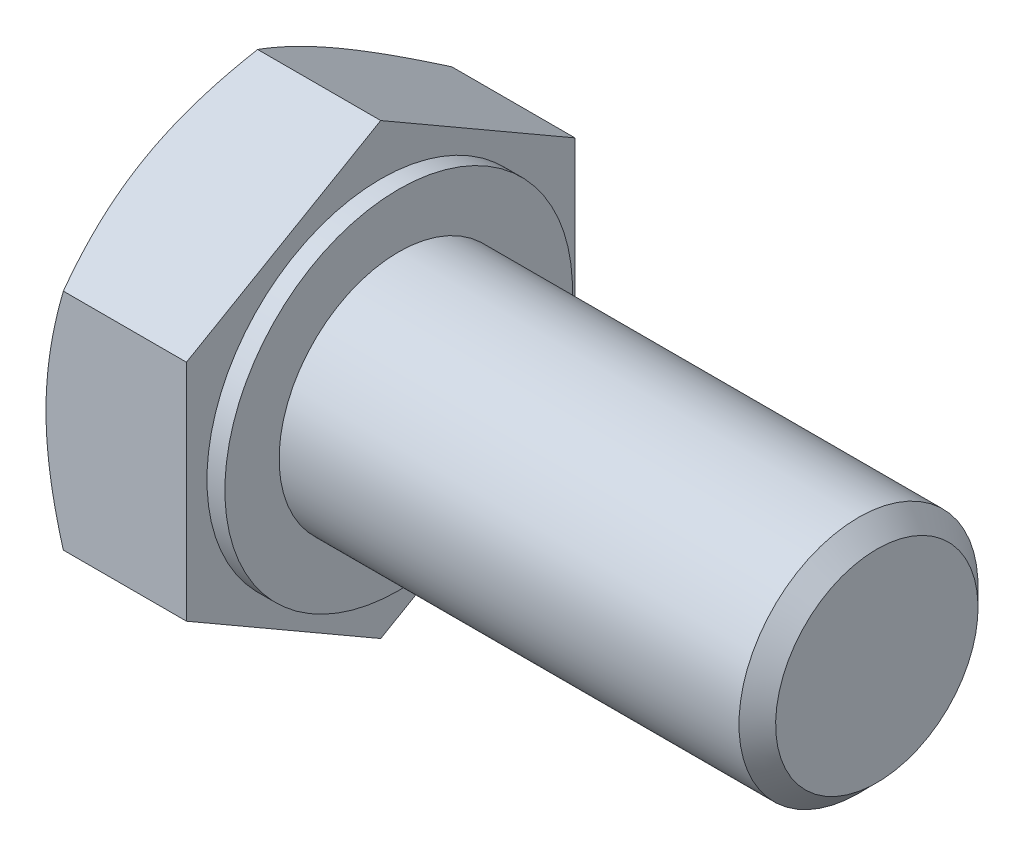
ISO-10303-21;
HEADER;
FILE_DESCRIPTION(('STEP AP214'),'2;1');
FILE_NAME('part.step','',(''),(''),'','','');
FILE_SCHEMA(('AUTOMOTIVE_DESIGN { 1 0 10303 214 1 1 1 1 }'));
ENDSEC;
DATA;
#1=APPLICATION_CONTEXT('core data for automotive mechanical design processes');
#2=APPLICATION_PROTOCOL_DEFINITION('international standard','automotive_design',2000,#1);
#3=PRODUCT_CONTEXT('',#1,'mechanical');
#4=PRODUCT('Part','Part','',(#3));
#5=PRODUCT_RELATED_PRODUCT_CATEGORY('part','',(#4));
#6=PRODUCT_DEFINITION_FORMATION('','',#4);
#7=PRODUCT_DEFINITION_CONTEXT('part definition',#1,'design');
#8=PRODUCT_DEFINITION('design','',#6,#7);
#9=PRODUCT_DEFINITION_SHAPE('','',#8);
#10=(LENGTH_UNIT() NAMED_UNIT(*) SI_UNIT(.MILLI.,.METRE.));
#11=(NAMED_UNIT(*) PLANE_ANGLE_UNIT() SI_UNIT($,.RADIAN.));
#12=(NAMED_UNIT(*) SI_UNIT($,.STERADIAN.) SOLID_ANGLE_UNIT());
#13=UNCERTAINTY_MEASURE_WITH_UNIT(LENGTH_MEASURE(1.E-05),#10,'distance_accuracy_value','');
#14=(GEOMETRIC_REPRESENTATION_CONTEXT(3) GLOBAL_UNCERTAINTY_ASSIGNED_CONTEXT((#13)) GLOBAL_UNIT_ASSIGNED_CONTEXT((#10,
#11,#12)) REPRESENTATION_CONTEXT('',''));
#15=CARTESIAN_POINT('',(0.,0.,0.));
#16=DIRECTION('',(0.,0.,1.));
#17=DIRECTION('',(1.,0.,0.));
#18=AXIS2_PLACEMENT_3D('',#15,#16,#17);
#19=CARTESIAN_POINT('',(15.693225,0.,0.));
#20=DIRECTION('',(-1.,0.,0.));
#21=DIRECTION('',(0.,-1.,0.));
#22=AXIS2_PLACEMENT_3D('',#19,#20,#21);
#23=CONICAL_SURFACE('',#22,3.693275,0.785316663805123);
#24=CARTESIAN_POINT('',(16.,0.,0.));
#25=DIRECTION('',(-1.,0.,0.));
#26=DIRECTION('',(0.,-1.,0.));
#27=AXIS2_PLACEMENT_3D('',#24,#25,#26);
#28=CIRCLE('',#27,3.38655);
#29=CARTESIAN_POINT('',(16.,3.38655,0.));
#30=VERTEX_POINT('',#29);
#31=EDGE_CURVE('E11',#30,#30,#28,.T.);
#32=ORIENTED_EDGE('',*,*,#31,.T.);
#33=DIRECTION('',(-0.707164407752514,0.707049149923848,0.));
#34=VECTOR('',#33,1.);
#35=CARTESIAN_POINT('',(15.693225,3.693275,0.));
#36=LINE('',#35,#34);
#37=CARTESIAN_POINT('',(15.38645,4.,0.));
#38=VERTEX_POINT('',#37);
#39=EDGE_CURVE('E27',#30,#38,#36,.T.);
#40=ORIENTED_EDGE('',*,*,#39,.T.);
#41=CARTESIAN_POINT('',(15.38645,0.,0.));
#42=DIRECTION('',(1.,0.,0.));
#43=DIRECTION('',(0.,-1.,0.));
#44=AXIS2_PLACEMENT_3D('',#41,#42,#43);
#45=CIRCLE('',#44,4.);
#46=CARTESIAN_POINT('',(15.38645,-4.,0.));
#47=VERTEX_POINT('',#46);
#48=EDGE_CURVE('E213',#38,#47,#45,.T.);
#49=ORIENTED_EDGE('',*,*,#48,.T.);
#50=CARTESIAN_POINT('',(15.38645,0.,0.));
#51=DIRECTION('',(1.,0.,0.));
#52=DIRECTION('',(0.,-1.,0.));
#53=AXIS2_PLACEMENT_3D('',#50,#51,#52);
#54=CIRCLE('',#53,4.);
#55=EDGE_CURVE('E206',#47,#38,#54,.T.);
#56=ORIENTED_EDGE('',*,*,#55,.T.);
#57=ORIENTED_EDGE('',*,*,#39,.F.);
#58=EDGE_LOOP('',(#32,#40,#49,#56,#57));
#59=FACE_BOUND('',#58,.T.);
#60=ADVANCED_FACE('F16',(#59),#23,.T.);
#61=CARTESIAN_POINT('',(9.5,0.,0.));
#62=DIRECTION('',(1.,0.,0.));
#63=DIRECTION('',(0.,1.,0.));
#64=AXIS2_PLACEMENT_3D('',#61,#62,#63);
#65=CYLINDRICAL_SURFACE('',#64,4.);
#66=ORIENTED_EDGE('',*,*,#48,.F.);
#67=ORIENTED_EDGE('',*,*,#55,.F.);
#68=DIRECTION('',(-1.,0.,0.));
#69=VECTOR('',#68,1.);
#70=CARTESIAN_POINT('',(9.5,-4.,0.));
#71=LINE('',#70,#69);
#72=CARTESIAN_POINT('',(0.,-4.,0.));
#73=VERTEX_POINT('',#72);
#74=EDGE_CURVE('E164',#47,#73,#71,.T.);
#75=ORIENTED_EDGE('',*,*,#74,.T.);
#76=CARTESIAN_POINT('',(0.,0.,0.));
#77=DIRECTION('',(1.,0.,0.));
#78=DIRECTION('',(0.,1.,0.));
#79=AXIS2_PLACEMENT_3D('',#76,#77,#78);
#80=CIRCLE('',#79,4.);
#81=CARTESIAN_POINT('',(0.,4.,0.));
#82=VERTEX_POINT('',#81);
#83=EDGE_CURVE('E159',#73,#82,#80,.T.);
#84=ORIENTED_EDGE('',*,*,#83,.T.);
#85=CARTESIAN_POINT('',(0.,0.,0.));
#86=DIRECTION('',(1.,0.,0.));
#87=DIRECTION('',(0.,1.,0.));
#88=AXIS2_PLACEMENT_3D('',#85,#86,#87);
#89=CIRCLE('',#88,4.);
#90=EDGE_CURVE('E163',#82,#73,#89,.T.);
#91=ORIENTED_EDGE('',*,*,#90,.T.);
#92=ORIENTED_EDGE('',*,*,#74,.F.);
#93=EDGE_LOOP('',(#66,#67,#75,#84,#91,#92));
#94=FACE_BOUND('',#93,.T.);
#95=ADVANCED_FACE('F161',(#94),#65,.T.);
#96=CARTESIAN_POINT('',(16.,2.,0.));
#97=DIRECTION('',(1.,0.,0.));
#98=DIRECTION('',(0.,1.,0.));
#99=AXIS2_PLACEMENT_3D('',#96,#97,#98);
#100=PLANE('',#99);
#101=ORIENTED_EDGE('',*,*,#31,.F.);
#102=EDGE_LOOP('',(#101));
#103=FACE_BOUND('',#102,.T.);
#104=ADVANCED_FACE('F443',(#103),#100,.T.);
#105=CARTESIAN_POINT('',(-5.00982170819963,0.,0.));
#106=DIRECTION('',(1.,0.,0.));
#107=DIRECTION('',(0.,1.,0.));
#108=AXIS2_PLACEMENT_3D('',#105,#106,#107);
#109=CONICAL_SURFACE('',#108,7.00277674973256,1.0471975511966);
#110=CARTESIAN_POINT('',(-5.3001,5.62916512459884,3.25));
#111=CARTESIAN_POINT('',(-5.30010000000002,4.7583302491977,4.75833024919769));
#112=CARTESIAN_POINT('',(-4.71954341639926,3.75277674973257,6.5));
#113=(BOUNDED_CURVE() B_SPLINE_CURVE(2,(#110,#111,#112),.UNSPECIFIED.,.F.,
.F.) B_SPLINE_CURVE_WITH_KNOTS((3,3),(0.380711317203905,0.76142263440781),
.UNSPECIFIED.) CURVE() GEOMETRIC_REPRESENTATION_ITEM() RATIONAL_B_SPLINE_CURVE((1.,
1.03795484930203,1.)) REPRESENTATION_ITEM(''));
#114=CARTESIAN_POINT('',(-5.3001,5.62916512459884,3.25));
#115=VERTEX_POINT('',#114);
#116=CARTESIAN_POINT('',(-4.71954341639926,3.75277674973253,6.5));
#117=VERTEX_POINT('',#116);
#118=EDGE_CURVE('E188',#115,#117,#113,.T.);
#119=ORIENTED_EDGE('',*,*,#118,.F.);
#120=CARTESIAN_POINT('',(-5.3001,0.,0.));
#121=DIRECTION('',(-1.,0.,0.));
#122=DIRECTION('',(0.,1.,0.));
#123=AXIS2_PLACEMENT_3D('',#120,#121,#122);
#124=CIRCLE('',#123,6.5);
#125=CARTESIAN_POINT('',(-5.3001,0.,6.5));
#126=VERTEX_POINT('',#125);
#127=EDGE_CURVE('E299',#126,#115,#124,.T.);
#128=ORIENTED_EDGE('',*,*,#127,.F.);
#129=CARTESIAN_POINT('',(-4.71954341639926,3.75277674973253,6.5));
#130=CARTESIAN_POINT('',(-5.30010000000001,1.74166975080228,6.5));
#131=CARTESIAN_POINT('',(-5.3001,0.,6.5));
#132=(BOUNDED_CURVE() B_SPLINE_CURVE(2,(#129,#130,#131),.UNSPECIFIED.,.F.,
.F.) B_SPLINE_CURVE_WITH_KNOTS((3,3),(0.,0.380711317203905),
.UNSPECIFIED.) CURVE() GEOMETRIC_REPRESENTATION_ITEM() RATIONAL_B_SPLINE_CURVE((1.,
1.03795484930204,1.)) REPRESENTATION_ITEM(''));
#133=EDGE_CURVE('E204',#117,#126,#132,.T.);
#134=ORIENTED_EDGE('',*,*,#133,.F.);
#135=EDGE_LOOP('',(#119,#128,#134));
#136=FACE_BOUND('',#135,.T.);
#137=ADVANCED_FACE('F416',(#136),#109,.T.);
#138=CARTESIAN_POINT('',(-5.00982170819963,0.,0.));
#139=DIRECTION('',(1.,0.,0.));
#140=DIRECTION('',(0.,1.,0.));
#141=AXIS2_PLACEMENT_3D('',#138,#139,#140);
#142=CONICAL_SURFACE('',#141,7.00277674973256,1.0471975511966);
#143=CARTESIAN_POINT('',(-4.71954341639926,-3.75277674973259,6.5));
#144=CARTESIAN_POINT('',(-5.30010000000001,-4.75833024919772,4.75833024919769));
#145=CARTESIAN_POINT('',(-5.3001,-5.62916512459885,3.25));
#146=(BOUNDED_CURVE() B_SPLINE_CURVE(2,(#143,#144,#145),.UNSPECIFIED.,.F.,
.F.) B_SPLINE_CURVE_WITH_KNOTS((3,3),(0.,0.380711317203904),
.UNSPECIFIED.) CURVE() GEOMETRIC_REPRESENTATION_ITEM() RATIONAL_B_SPLINE_CURVE((1.,
1.03795484930205,1.)) REPRESENTATION_ITEM(''));
#147=CARTESIAN_POINT('',(-4.71954341639926,-3.75277674973254,6.5));
#148=VERTEX_POINT('',#147);
#149=CARTESIAN_POINT('',(-5.3001,-5.62916512459885,3.25));
#150=VERTEX_POINT('',#149);
#151=EDGE_CURVE('E308',#148,#150,#146,.T.);
#152=ORIENTED_EDGE('',*,*,#151,.F.);
#153=CARTESIAN_POINT('',(-5.3001,0.,6.5));
#154=CARTESIAN_POINT('',(-5.30010000000001,-1.74166975080229,6.49999999999999));
#155=CARTESIAN_POINT('',(-4.71954341639926,-3.75277674973254,6.5));
#156=(BOUNDED_CURVE() B_SPLINE_CURVE(2,(#153,#154,#155),.UNSPECIFIED.,.F.,
.F.) B_SPLINE_CURVE_WITH_KNOTS((3,3),(0.380711317203905,0.76142263440781),
.UNSPECIFIED.) CURVE() GEOMETRIC_REPRESENTATION_ITEM() RATIONAL_B_SPLINE_CURVE((1.,
1.03795484930202,1.)) REPRESENTATION_ITEM(''));
#157=EDGE_CURVE('E214',#126,#148,#156,.T.);
#158=ORIENTED_EDGE('',*,*,#157,.F.);
#159=CARTESIAN_POINT('',(-5.3001,0.,0.));
#160=DIRECTION('',(-1.,0.,0.));
#161=DIRECTION('',(0.,1.,0.));
#162=AXIS2_PLACEMENT_3D('',#159,#160,#161);
#163=CIRCLE('',#162,6.5);
#164=EDGE_CURVE('E347',#150,#126,#163,.T.);
#165=ORIENTED_EDGE('',*,*,#164,.F.);
#166=EDGE_LOOP('',(#152,#158,#165));
#167=FACE_BOUND('',#166,.T.);
#168=ADVANCED_FACE('F410',(#167),#142,.T.);
#169=CARTESIAN_POINT('',(-5.00982170819963,0.,0.));
#170=DIRECTION('',(1.,0.,0.));
#171=DIRECTION('',(0.,1.,0.));
#172=AXIS2_PLACEMENT_3D('',#169,#170,#171);
#173=CONICAL_SURFACE('',#172,7.00277674973256,1.0471975511966);
#174=CARTESIAN_POINT('',(-5.3001,5.62916512459885,-3.25));
#175=CARTESIAN_POINT('',(-5.30010000000001,6.49999999999999,-1.74166975080229));
#176=CARTESIAN_POINT('',(-4.71954341639926,7.50555349946511,0.));
#177=(BOUNDED_CURVE() B_SPLINE_CURVE(2,(#174,#175,#176),.UNSPECIFIED.,.F.,
.F.) B_SPLINE_CURVE_WITH_KNOTS((3,3),(0.380711317203905,0.76142263440781),
.UNSPECIFIED.) CURVE() GEOMETRIC_REPRESENTATION_ITEM() RATIONAL_B_SPLINE_CURVE((1.,
1.03795484930206,1.)) REPRESENTATION_ITEM(''));
#178=CARTESIAN_POINT('',(-5.3001,5.62916512459885,-3.25));
#179=VERTEX_POINT('',#178);
#180=CARTESIAN_POINT('',(-4.71954341639926,7.50555349946511,0.));
#181=VERTEX_POINT('',#180);
#182=EDGE_CURVE('E222',#179,#181,#177,.T.);
#183=ORIENTED_EDGE('',*,*,#182,.F.);
#184=CARTESIAN_POINT('',(-5.3001,0.,0.));
#185=DIRECTION('',(-1.,0.,0.));
#186=DIRECTION('',(0.,1.,0.));
#187=AXIS2_PLACEMENT_3D('',#184,#185,#186);
#188=CIRCLE('',#187,6.5);
#189=EDGE_CURVE('E303',#115,#179,#188,.T.);
#190=ORIENTED_EDGE('',*,*,#189,.F.);
#191=CARTESIAN_POINT('',(-4.71954341639926,7.50555349946512,0.));
#192=CARTESIAN_POINT('',(-5.30010000000001,6.5,1.74166975080231));
#193=CARTESIAN_POINT('',(-5.3001,5.62916512459884,3.25));
#194=(BOUNDED_CURVE() B_SPLINE_CURVE(2,(#191,#192,#193),.UNSPECIFIED.,.F.,
.F.) B_SPLINE_CURVE_WITH_KNOTS((3,3),(0.,0.380711317203905),
.UNSPECIFIED.) CURVE() GEOMETRIC_REPRESENTATION_ITEM() RATIONAL_B_SPLINE_CURVE((1.,
1.03795484930205,1.)) REPRESENTATION_ITEM(''));
#195=EDGE_CURVE('E194',#181,#115,#194,.T.);
#196=ORIENTED_EDGE('',*,*,#195,.F.);
#197=EDGE_LOOP('',(#183,#190,#196));
#198=FACE_BOUND('',#197,.T.);
#199=ADVANCED_FACE('F418',(#198),#173,.T.);
#200=CARTESIAN_POINT('',(-5.00982170819963,0.,0.));
#201=DIRECTION('',(1.,0.,0.));
#202=DIRECTION('',(0.,-1.,0.));
#203=AXIS2_PLACEMENT_3D('',#200,#201,#202);
#204=CONICAL_SURFACE('',#203,7.00277674973256,1.0471975511966);
#205=CARTESIAN_POINT('',(-4.71954341639926,-7.50555349946512,0.));
#206=CARTESIAN_POINT('',(-5.30010000000001,-6.49999999999999,-1.74166975080231));
#207=CARTESIAN_POINT('',(-5.3001,-5.62916512459885,-3.25));
#208=(BOUNDED_CURVE() B_SPLINE_CURVE(2,(#205,#206,#207),.UNSPECIFIED.,.F.,
.F.) B_SPLINE_CURVE_WITH_KNOTS((3,3),(0.,0.380711317203904),
.UNSPECIFIED.) CURVE() GEOMETRIC_REPRESENTATION_ITEM() RATIONAL_B_SPLINE_CURVE((1.,
1.03795484930204,1.)) REPRESENTATION_ITEM(''));
#209=CARTESIAN_POINT('',(-4.71954341639926,-7.50555349946511,0.));
#210=VERTEX_POINT('',#209);
#211=CARTESIAN_POINT('',(-5.3001,-5.62916512459885,-3.25));
#212=VERTEX_POINT('',#211);
#213=EDGE_CURVE('E302',#210,#212,#208,.T.);
#214=ORIENTED_EDGE('',*,*,#213,.F.);
#215=CARTESIAN_POINT('',(-5.3001,-5.62916512459885,3.25));
#216=CARTESIAN_POINT('',(-5.30010000000001,-6.5,1.74166975080231));
#217=CARTESIAN_POINT('',(-4.71954341639926,-7.50555349946511,0.));
#218=(BOUNDED_CURVE() B_SPLINE_CURVE(2,(#215,#216,#217),.UNSPECIFIED.,.F.,
.F.) B_SPLINE_CURVE_WITH_KNOTS((3,3),(0.380711317203904,0.761422634407808),
.UNSPECIFIED.) CURVE() GEOMETRIC_REPRESENTATION_ITEM() RATIONAL_B_SPLINE_CURVE((1.,
1.03795484930205,1.)) REPRESENTATION_ITEM(''));
#219=EDGE_CURVE('E195',#150,#210,#218,.T.);
#220=ORIENTED_EDGE('',*,*,#219,.F.);
#221=CARTESIAN_POINT('',(-5.3001,0.,0.));
#222=DIRECTION('',(-1.,0.,0.));
#223=DIRECTION('',(0.,1.,0.));
#224=AXIS2_PLACEMENT_3D('',#221,#222,#223);
#225=CIRCLE('',#224,6.5);
#226=EDGE_CURVE('E118',#212,#150,#225,.T.);
#227=ORIENTED_EDGE('',*,*,#226,.F.);
#228=EDGE_LOOP('',(#214,#220,#227));
#229=FACE_BOUND('',#228,.T.);
#230=ADVANCED_FACE('F379',(#229),#204,.T.);
#231=CARTESIAN_POINT('',(-5.00982170819963,0.,0.));
#232=DIRECTION('',(1.,0.,0.));
#233=DIRECTION('',(0.,1.,0.));
#234=AXIS2_PLACEMENT_3D('',#231,#232,#233);
#235=CONICAL_SURFACE('',#234,7.00277674973256,1.0471975511966);
#236=CARTESIAN_POINT('',(-5.3001,0.,-6.5));
#237=CARTESIAN_POINT('',(-5.30010000000001,1.74166975080229,-6.5));
#238=CARTESIAN_POINT('',(-4.71954341639926,3.75277674973254,-6.5));
#239=(BOUNDED_CURVE() B_SPLINE_CURVE(2,(#236,#237,#238),.UNSPECIFIED.,.F.,
.F.) B_SPLINE_CURVE_WITH_KNOTS((3,3),(0.380711317203905,0.761422634407809),
.UNSPECIFIED.) CURVE() GEOMETRIC_REPRESENTATION_ITEM() RATIONAL_B_SPLINE_CURVE((1.,
1.03795484930204,1.)) REPRESENTATION_ITEM(''));
#240=CARTESIAN_POINT('',(-5.3001,0.,-6.5));
#241=VERTEX_POINT('',#240);
#242=CARTESIAN_POINT('',(-4.71954341639926,3.75277674973253,-6.5));
#243=VERTEX_POINT('',#242);
#244=EDGE_CURVE('E177',#241,#243,#239,.T.);
#245=ORIENTED_EDGE('',*,*,#244,.F.);
#246=CARTESIAN_POINT('',(-5.3001,0.,0.));
#247=DIRECTION('',(-1.,0.,0.));
#248=DIRECTION('',(0.,1.,0.));
#249=AXIS2_PLACEMENT_3D('',#246,#247,#248);
#250=CIRCLE('',#249,6.5);
#251=EDGE_CURVE('E106',#179,#241,#250,.T.);
#252=ORIENTED_EDGE('',*,*,#251,.F.);
#253=CARTESIAN_POINT('',(-4.71954341639926,3.75277674973258,-6.5));
#254=CARTESIAN_POINT('',(-5.30010000000001,4.75833024919771,-4.7583302491977));
#255=CARTESIAN_POINT('',(-5.3001,5.62916512459885,-3.25));
#256=(BOUNDED_CURVE() B_SPLINE_CURVE(2,(#253,#254,#255),.UNSPECIFIED.,.F.,
.F.) B_SPLINE_CURVE_WITH_KNOTS((3,3),(0.,0.380711317203905),
.UNSPECIFIED.) CURVE() GEOMETRIC_REPRESENTATION_ITEM() RATIONAL_B_SPLINE_CURVE((1.,
1.03795484930205,1.)) REPRESENTATION_ITEM(''));
#257=EDGE_CURVE('E187',#243,#179,#256,.T.);
#258=ORIENTED_EDGE('',*,*,#257,.F.);
#259=EDGE_LOOP('',(#245,#252,#258));
#260=FACE_BOUND('',#259,.T.);
#261=ADVANCED_FACE('F420',(#260),#235,.T.);
#262=CARTESIAN_POINT('',(-5.00982170819963,0.,0.));
#263=DIRECTION('',(1.,0.,0.));
#264=DIRECTION('',(0.,1.,0.));
#265=AXIS2_PLACEMENT_3D('',#262,#263,#264);
#266=CONICAL_SURFACE('',#265,7.00277674973256,1.0471975511966);
#267=CARTESIAN_POINT('',(-4.71954341639926,-3.75277674973253,-6.5));
#268=CARTESIAN_POINT('',(-5.30010000000001,-1.74166975080229,-6.5));
#269=CARTESIAN_POINT('',(-5.3001,0.,-6.5));
#270=(BOUNDED_CURVE() B_SPLINE_CURVE(2,(#267,#268,#269),.UNSPECIFIED.,.F.,
.F.) B_SPLINE_CURVE_WITH_KNOTS((3,3),(0.,0.380711317203905),
.UNSPECIFIED.) CURVE() GEOMETRIC_REPRESENTATION_ITEM() RATIONAL_B_SPLINE_CURVE((1.,
1.03795484930204,1.)) REPRESENTATION_ITEM(''));
#271=CARTESIAN_POINT('',(-4.71954341639926,-3.75277674973258,-6.5));
#272=VERTEX_POINT('',#271);
#273=EDGE_CURVE('E170',#272,#241,#270,.T.);
#274=ORIENTED_EDGE('',*,*,#273,.F.);
#275=CARTESIAN_POINT('',(-5.3001,-5.62916512459885,-3.25));
#276=CARTESIAN_POINT('',(-5.30010000000001,-4.75833024919771,-4.7583302491977));
#277=CARTESIAN_POINT('',(-4.71954341639926,-3.75277674973258,-6.5));
#278=(BOUNDED_CURVE() B_SPLINE_CURVE(2,(#275,#276,#277),.UNSPECIFIED.,.F.,
.F.) B_SPLINE_CURVE_WITH_KNOTS((3,3),(0.380711317203904,0.761422634407809),
.UNSPECIFIED.) CURVE() GEOMETRIC_REPRESENTATION_ITEM() RATIONAL_B_SPLINE_CURVE((1.,
1.03795484930205,1.)) REPRESENTATION_ITEM(''));
#279=EDGE_CURVE('E319',#212,#272,#278,.T.);
#280=ORIENTED_EDGE('',*,*,#279,.F.);
#281=CARTESIAN_POINT('',(-5.3001,0.,0.));
#282=DIRECTION('',(-1.,0.,0.));
#283=DIRECTION('',(0.,1.,0.));
#284=AXIS2_PLACEMENT_3D('',#281,#282,#283);
#285=CIRCLE('',#284,6.5);
#286=EDGE_CURVE('E281',#241,#212,#285,.T.);
#287=ORIENTED_EDGE('',*,*,#286,.F.);
#288=EDGE_LOOP('',(#274,#280,#287));
#289=FACE_BOUND('',#288,.T.);
#290=ADVANCED_FACE('F425',(#289),#266,.T.);
#291=CARTESIAN_POINT('',(-0.600099999999993,-3.75277674973256,-6.5));
#292=DIRECTION('',(0.,0.,-1.));
#293=DIRECTION('',(-1.,0.,0.));
#294=AXIS2_PLACEMENT_3D('',#291,#292,#293);
#295=PLANE('',#294);
#296=ORIENTED_EDGE('',*,*,#273,.T.);
#297=ORIENTED_EDGE('',*,*,#244,.T.);
#298=DIRECTION('',(-1.,0.,0.));
#299=VECTOR('',#298,1.);
#300=CARTESIAN_POINT('',(-0.6001,3.75277674973256,-6.5));
#301=LINE('',#300,#299);
#302=CARTESIAN_POINT('',(-0.6001,3.75277674973256,-6.5));
#303=VERTEX_POINT('',#302);
#304=EDGE_CURVE('E231',#303,#243,#301,.T.);
#305=ORIENTED_EDGE('',*,*,#304,.F.);
#306=DIRECTION('',(0.,1.,0.));
#307=VECTOR('',#306,1.);
#308=CARTESIAN_POINT('',(-0.600099999999993,-3.75277674973256,-6.5));
#309=LINE('',#308,#307);
#310=CARTESIAN_POINT('',(-0.600099999999993,-3.75277674973256,-6.5));
#311=VERTEX_POINT('',#310);
#312=EDGE_CURVE('E240',#311,#303,#309,.T.);
#313=ORIENTED_EDGE('',*,*,#312,.F.);
#314=DIRECTION('',(-1.,0.,0.));
#315=VECTOR('',#314,1.);
#316=CARTESIAN_POINT('',(-0.600099999999993,-3.75277674973256,-6.5));
#317=LINE('',#316,#315);
#318=EDGE_CURVE('E183',#311,#272,#317,.T.);
#319=ORIENTED_EDGE('',*,*,#318,.T.);
#320=EDGE_LOOP('',(#296,#297,#305,#313,#319));
#321=FACE_BOUND('',#320,.T.);
#322=ADVANCED_FACE('F422',(#321),#295,.T.);
#323=CARTESIAN_POINT('',(-0.6001,3.75277674973256,-6.5));
#324=DIRECTION('',(0.,0.866025403784439,-0.5));
#325=DIRECTION('',(-1.,0.,0.));
#326=AXIS2_PLACEMENT_3D('',#323,#324,#325);
#327=PLANE('',#326);
#328=ORIENTED_EDGE('',*,*,#257,.T.);
#329=ORIENTED_EDGE('',*,*,#182,.T.);
#330=DIRECTION('',(-1.,0.,0.));
#331=VECTOR('',#330,1.);
#332=CARTESIAN_POINT('',(-0.6001,7.50555349946513,0.));
#333=LINE('',#332,#331);
#334=CARTESIAN_POINT('',(-0.6001,7.50555349946513,0.));
#335=VERTEX_POINT('',#334);
#336=EDGE_CURVE('E181',#335,#181,#333,.T.);
#337=ORIENTED_EDGE('',*,*,#336,.F.);
#338=DIRECTION('',(0.,0.5,0.866025403784439));
#339=VECTOR('',#338,1.);
#340=CARTESIAN_POINT('',(-0.6001,3.75277674973256,-6.5));
#341=LINE('',#340,#339);
#342=EDGE_CURVE('E220',#303,#335,#341,.T.);
#343=ORIENTED_EDGE('',*,*,#342,.F.);
#344=ORIENTED_EDGE('',*,*,#304,.T.);
#345=EDGE_LOOP('',(#328,#329,#337,#343,#344));
#346=FACE_BOUND('',#345,.T.);
#347=ADVANCED_FACE('F264',(#346),#327,.T.);
#348=CARTESIAN_POINT('',(-0.6001,7.50555349946513,0.));
#349=DIRECTION('',(0.,0.866025403784438,0.5));
#350=DIRECTION('',(1.,0.,0.));
#351=AXIS2_PLACEMENT_3D('',#348,#349,#350);
#352=PLANE('',#351);
#353=ORIENTED_EDGE('',*,*,#195,.T.);
#354=ORIENTED_EDGE('',*,*,#118,.T.);
#355=DIRECTION('',(-1.,0.,0.));
#356=VECTOR('',#355,1.);
#357=CARTESIAN_POINT('',(-0.6001,3.75277674973256,6.5));
#358=LINE('',#357,#356);
#359=CARTESIAN_POINT('',(-0.6001,3.75277674973256,6.5));
#360=VERTEX_POINT('',#359);
#361=EDGE_CURVE('E221',#360,#117,#358,.T.);
#362=ORIENTED_EDGE('',*,*,#361,.F.);
#363=DIRECTION('',(0.,-0.5,0.866025403784438));
#364=VECTOR('',#363,1.);
#365=CARTESIAN_POINT('',(-0.6001,7.50555349946513,0.));
#366=LINE('',#365,#364);
#367=EDGE_CURVE('E257',#335,#360,#366,.T.);
#368=ORIENTED_EDGE('',*,*,#367,.F.);
#369=ORIENTED_EDGE('',*,*,#336,.T.);
#370=EDGE_LOOP('',(#353,#354,#362,#368,#369));
#371=FACE_BOUND('',#370,.T.);
#372=ADVANCED_FACE('F269',(#371),#352,.T.);
#373=CARTESIAN_POINT('',(-0.6001,0.,0.));
#374=DIRECTION('',(1.,0.,0.));
#375=DIRECTION('',(0.,1.,0.));
#376=AXIS2_PLACEMENT_3D('',#373,#374,#375);
#377=PLANE('',#376);
#378=ORIENTED_EDGE('',*,*,#367,.T.);
#379=DIRECTION('',(0.,-1.,0.));
#380=VECTOR('',#379,1.);
#381=CARTESIAN_POINT('',(-0.6001,3.75277674973256,6.5));
#382=LINE('',#381,#380);
#383=CARTESIAN_POINT('',(-0.600099999999993,-3.75277674973257,6.5));
#384=VERTEX_POINT('',#383);
#385=EDGE_CURVE('E272',#360,#384,#382,.T.);
#386=ORIENTED_EDGE('',*,*,#385,.T.);
#387=DIRECTION('',(0.,-0.5,-0.866025403784439));
#388=VECTOR('',#387,1.);
#389=CARTESIAN_POINT('',(-0.600099999999993,-3.75277674973257,6.5));
#390=LINE('',#389,#388);
#391=CARTESIAN_POINT('',(-0.600099999999993,-7.50555349946513,0.));
#392=VERTEX_POINT('',#391);
#393=EDGE_CURVE('E277',#384,#392,#390,.T.);
#394=ORIENTED_EDGE('',*,*,#393,.T.);
#395=DIRECTION('',(0.,0.5,-0.866025403784439));
#396=VECTOR('',#395,1.);
#397=CARTESIAN_POINT('',(-0.600099999999993,-7.50555349946513,0.));
#398=LINE('',#397,#396);
#399=EDGE_CURVE('E245',#392,#311,#398,.T.);
#400=ORIENTED_EDGE('',*,*,#399,.T.);
#401=ORIENTED_EDGE('',*,*,#312,.T.);
#402=ORIENTED_EDGE('',*,*,#342,.T.);
#403=EDGE_LOOP('',(#378,#386,#394,#400,#401,#402));
#404=FACE_BOUND('',#403,.T.);
#405=CARTESIAN_POINT('',(-0.6001,0.,0.));
#406=DIRECTION('',(1.,0.,0.));
#407=DIRECTION('',(0.,1.,0.));
#408=AXIS2_PLACEMENT_3D('',#405,#406,#407);
#409=CIRCLE('',#408,5.815);
#410=CARTESIAN_POINT('',(-0.6001,5.815,0.));
#411=VERTEX_POINT('',#410);
#412=CARTESIAN_POINT('',(-0.6001,-5.815,0.));
#413=VERTEX_POINT('',#412);
#414=EDGE_CURVE('E136',#411,#413,#409,.T.);
#415=ORIENTED_EDGE('',*,*,#414,.F.);
#416=CARTESIAN_POINT('',(-0.6001,0.,0.));
#417=DIRECTION('',(1.,0.,0.));
#418=DIRECTION('',(0.,1.,0.));
#419=AXIS2_PLACEMENT_3D('',#416,#417,#418);
#420=CIRCLE('',#419,5.815);
#421=EDGE_CURVE('E288',#413,#411,#420,.T.);
#422=ORIENTED_EDGE('',*,*,#421,.F.);
#423=EDGE_LOOP('',(#415,#422));
#424=FACE_BOUND('',#423,.T.);
#425=ADVANCED_FACE('F253',(#404,#424),#377,.T.);
#426=CARTESIAN_POINT('',(-0.6001,3.75277674973256,6.5));
#427=DIRECTION('',(0.,0.,1.));
#428=DIRECTION('',(0.,-1.,0.));
#429=AXIS2_PLACEMENT_3D('',#426,#427,#428);
#430=PLANE('',#429);
#431=ORIENTED_EDGE('',*,*,#157,.T.);
#432=DIRECTION('',(-1.,0.,0.));
#433=VECTOR('',#432,1.);
#434=CARTESIAN_POINT('',(-0.600099999999993,-3.75277674973257,6.5));
#435=LINE('',#434,#433);
#436=EDGE_CURVE('E205',#384,#148,#435,.T.);
#437=ORIENTED_EDGE('',*,*,#436,.F.);
#438=ORIENTED_EDGE('',*,*,#385,.F.);
#439=ORIENTED_EDGE('',*,*,#361,.T.);
#440=ORIENTED_EDGE('',*,*,#133,.T.);
#441=EDGE_LOOP('',(#431,#437,#438,#439,#440));
#442=FACE_BOUND('',#441,.T.);
#443=ADVANCED_FACE('F409',(#442),#430,.T.);
#444=CARTESIAN_POINT('',(-0.600099999999993,-3.75277674973257,6.5));
#445=DIRECTION('',(0.,-0.866025403784439,0.5));
#446=DIRECTION('',(-1.,0.,0.));
#447=AXIS2_PLACEMENT_3D('',#444,#445,#446);
#448=PLANE('',#447);
#449=ORIENTED_EDGE('',*,*,#219,.T.);
#450=DIRECTION('',(-1.,0.,0.));
#451=VECTOR('',#450,1.);
#452=CARTESIAN_POINT('',(-0.600099999999993,-7.50555349946513,0.));
#453=LINE('',#452,#451);
#454=EDGE_CURVE('E20',#392,#210,#453,.T.);
#455=ORIENTED_EDGE('',*,*,#454,.F.);
#456=ORIENTED_EDGE('',*,*,#393,.F.);
#457=ORIENTED_EDGE('',*,*,#436,.T.);
#458=ORIENTED_EDGE('',*,*,#151,.T.);
#459=EDGE_LOOP('',(#449,#455,#456,#457,#458));
#460=FACE_BOUND('',#459,.T.);
#461=ADVANCED_FACE('F372',(#460),#448,.T.);
#462=CARTESIAN_POINT('',(-0.600099999999993,-7.50555349946513,0.));
#463=DIRECTION('',(0.,-0.866025403784439,-0.5));
#464=DIRECTION('',(0.,0.5,-0.866025403784439));
#465=AXIS2_PLACEMENT_3D('',#462,#463,#464);
#466=PLANE('',#465);
#467=ORIENTED_EDGE('',*,*,#279,.T.);
#468=ORIENTED_EDGE('',*,*,#318,.F.);
#469=ORIENTED_EDGE('',*,*,#399,.F.);
#470=ORIENTED_EDGE('',*,*,#454,.T.);
#471=ORIENTED_EDGE('',*,*,#213,.T.);
#472=EDGE_LOOP('',(#467,#468,#469,#470,#471));
#473=FACE_BOUND('',#472,.T.);
#474=ADVANCED_FACE('F405',(#473),#466,.T.);
#475=CARTESIAN_POINT('',(-5.3001,0.,0.));
#476=DIRECTION('',(1.,0.,0.));
#477=DIRECTION('',(0.,1.,0.));
#478=AXIS2_PLACEMENT_3D('',#475,#476,#477);
#479=PLANE('',#478);
#480=ORIENTED_EDGE('',*,*,#127,.T.);
#481=ORIENTED_EDGE('',*,*,#189,.T.);
#482=ORIENTED_EDGE('',*,*,#251,.T.);
#483=ORIENTED_EDGE('',*,*,#286,.T.);
#484=ORIENTED_EDGE('',*,*,#226,.T.);
#485=ORIENTED_EDGE('',*,*,#164,.T.);
#486=EDGE_LOOP('',(#480,#481,#482,#483,#484,#485));
#487=FACE_BOUND('',#486,.T.);
#488=ADVANCED_FACE('F380',(#487),#479,.F.);
#489=CARTESIAN_POINT('',(-0.300049999999996,0.,0.));
#490=DIRECTION('',(1.,0.,0.));
#491=DIRECTION('',(0.,1.,0.));
#492=AXIS2_PLACEMENT_3D('',#489,#490,#491);
#493=CYLINDRICAL_SURFACE('',#492,5.815);
#494=CARTESIAN_POINT('',(0.,0.,0.));
#495=DIRECTION('',(1.,0.,0.));
#496=DIRECTION('',(0.,1.,0.));
#497=AXIS2_PLACEMENT_3D('',#494,#495,#496);
#498=CIRCLE('',#497,5.815);
#499=CARTESIAN_POINT('',(0.,5.815,0.));
#500=VERTEX_POINT('',#499);
#501=CARTESIAN_POINT('',(0.,-5.815,0.));
#502=VERTEX_POINT('',#501);
#503=EDGE_CURVE('E145',#500,#502,#498,.T.);
#504=ORIENTED_EDGE('',*,*,#503,.F.);
#505=CARTESIAN_POINT('',(0.,0.,0.));
#506=DIRECTION('',(1.,0.,0.));
#507=DIRECTION('',(0.,1.,0.));
#508=AXIS2_PLACEMENT_3D('',#505,#506,#507);
#509=CIRCLE('',#508,5.815);
#510=EDGE_CURVE('E310',#502,#500,#509,.T.);
#511=ORIENTED_EDGE('',*,*,#510,.F.);
#512=DIRECTION('',(-1.,0.,0.));
#513=VECTOR('',#512,1.);
#514=CARTESIAN_POINT('',(-0.300049999999996,-5.815,0.));
#515=LINE('',#514,#513);
#516=EDGE_CURVE('E329',#502,#413,#515,.T.);
#517=ORIENTED_EDGE('',*,*,#516,.T.);
#518=ORIENTED_EDGE('',*,*,#421,.T.);
#519=ORIENTED_EDGE('',*,*,#414,.T.);
#520=ORIENTED_EDGE('',*,*,#516,.F.);
#521=EDGE_LOOP('',(#504,#511,#517,#518,#519,#520));
#522=FACE_BOUND('',#521,.T.);
#523=ADVANCED_FACE('F18',(#522),#493,.T.);
#524=CARTESIAN_POINT('',(0.,4.9075,0.));
#525=DIRECTION('',(1.,0.,0.));
#526=DIRECTION('',(0.,1.,0.));
#527=AXIS2_PLACEMENT_3D('',#524,#525,#526);
#528=PLANE('',#527);
#529=ORIENTED_EDGE('',*,*,#503,.T.);
#530=ORIENTED_EDGE('',*,*,#510,.T.);
#531=EDGE_LOOP('',(#529,#530));
#532=FACE_BOUND('',#531,.T.);
#533=ORIENTED_EDGE('',*,*,#90,.F.);
#534=ORIENTED_EDGE('',*,*,#83,.F.);
#535=EDGE_LOOP('',(#533,#534));
#536=FACE_BOUND('',#535,.T.);
#537=ADVANCED_FACE('F168',(#532,#536),#528,.T.);
#538=CLOSED_SHELL('',(#60,#95,#104,#137,#168,#199,#230,#261,#290,#322,#347,#372,#425,#443,#461,
#474,#488,#523,#537));
#539=MANIFOLD_SOLID_BREP('B1',#538);
#540=ADVANCED_BREP_SHAPE_REPRESENTATION('',(#18,#539),#14);
#541=SHAPE_DEFINITION_REPRESENTATION(#9,#540);
ENDSEC;
END-ISO-10303-21;
